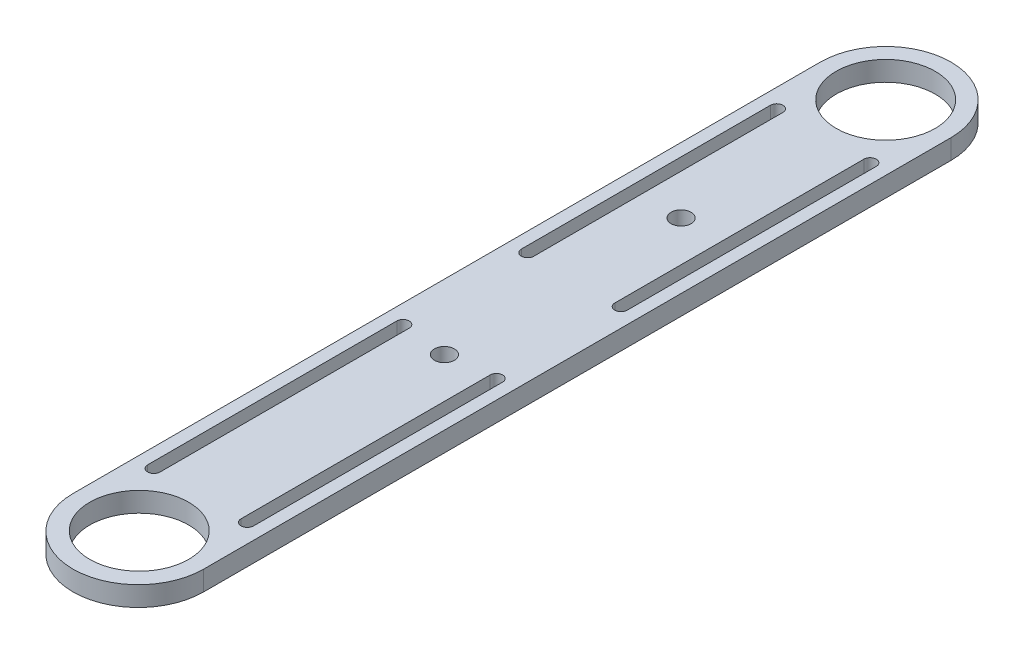
ISO-10303-21;
HEADER;
FILE_DESCRIPTION(('STEP AP214'),'2;1');
FILE_NAME('part.step','',(''),(''),'','','');
FILE_SCHEMA(('AUTOMOTIVE_DESIGN { 1 0 10303 214 1 1 1 1 }'));
ENDSEC;
DATA;
#1=APPLICATION_CONTEXT('core data for automotive mechanical design processes');
#2=APPLICATION_PROTOCOL_DEFINITION('international standard','automotive_design',2000,#1);
#3=PRODUCT_CONTEXT('',#1,'mechanical');
#4=PRODUCT('Part','Part','',(#3));
#5=PRODUCT_RELATED_PRODUCT_CATEGORY('part','',(#4));
#6=PRODUCT_DEFINITION_FORMATION('','',#4);
#7=PRODUCT_DEFINITION_CONTEXT('part definition',#1,'design');
#8=PRODUCT_DEFINITION('design','',#6,#7);
#9=PRODUCT_DEFINITION_SHAPE('','',#8);
#10=(LENGTH_UNIT() NAMED_UNIT(*) SI_UNIT(.MILLI.,.METRE.));
#11=(NAMED_UNIT(*) PLANE_ANGLE_UNIT() SI_UNIT($,.RADIAN.));
#12=(NAMED_UNIT(*) SI_UNIT($,.STERADIAN.) SOLID_ANGLE_UNIT());
#13=UNCERTAINTY_MEASURE_WITH_UNIT(LENGTH_MEASURE(1.E-05),#10,'distance_accuracy_value','');
#14=(GEOMETRIC_REPRESENTATION_CONTEXT(3) GLOBAL_UNCERTAINTY_ASSIGNED_CONTEXT((#13)) GLOBAL_UNIT_ASSIGNED_CONTEXT((#10,
#11,#12)) REPRESENTATION_CONTEXT('',''));
#15=CARTESIAN_POINT('',(0.,0.,0.));
#16=DIRECTION('',(0.,0.,1.));
#17=DIRECTION('',(1.,0.,0.));
#18=AXIS2_PLACEMENT_3D('',#15,#16,#17);
#19=CARTESIAN_POINT('',(0.,3.175,0.));
#20=DIRECTION('',(0.,-1.,0.));
#21=DIRECTION('',(0.,0.,-1.));
#22=AXIS2_PLACEMENT_3D('',#19,#20,#21);
#23=CYLINDRICAL_SURFACE('',#22,10.5);
#24=CARTESIAN_POINT('',(0.,0.,0.));
#25=DIRECTION('',(0.,1.,0.));
#26=DIRECTION('',(0.,0.,1.));
#27=AXIS2_PLACEMENT_3D('',#24,#25,#26);
#28=CIRCLE('',#27,10.5);
#29=CARTESIAN_POINT('',(10.5,0.,0.));
#30=VERTEX_POINT('',#29);
#31=CARTESIAN_POINT('',(-10.5,0.,0.));
#32=VERTEX_POINT('',#31);
#33=EDGE_CURVE('E275',#30,#32,#28,.T.);
#34=ORIENTED_EDGE('',*,*,#33,.T.);
#35=DIRECTION('',(0.,-1.,0.));
#36=VECTOR('',#35,1.);
#37=CARTESIAN_POINT('',(-10.5,3.175,0.));
#38=LINE('',#37,#36);
#39=CARTESIAN_POINT('',(-10.5,3.175,0.));
#40=VERTEX_POINT('',#39);
#41=EDGE_CURVE('E304',#40,#32,#38,.T.);
#42=ORIENTED_EDGE('',*,*,#41,.F.);
#43=CARTESIAN_POINT('',(0.,3.175,0.));
#44=DIRECTION('',(0.,1.,0.));
#45=DIRECTION('',(0.,0.,1.));
#46=AXIS2_PLACEMENT_3D('',#43,#44,#45);
#47=CIRCLE('',#46,10.5);
#48=CARTESIAN_POINT('',(10.5,3.175,0.));
#49=VERTEX_POINT('',#48);
#50=EDGE_CURVE('E278',#49,#40,#47,.T.);
#51=ORIENTED_EDGE('',*,*,#50,.F.);
#52=DIRECTION('',(0.,-1.,0.));
#53=VECTOR('',#52,1.);
#54=CARTESIAN_POINT('',(10.5,3.175,0.));
#55=LINE('',#54,#53);
#56=EDGE_CURVE('E288',#49,#30,#55,.T.);
#57=ORIENTED_EDGE('',*,*,#56,.T.);
#58=EDGE_LOOP('',(#34,#42,#51,#57));
#59=FACE_BOUND('',#58,.T.);
#60=ADVANCED_FACE('F33',(#59),#23,.T.);
#61=CARTESIAN_POINT('',(-10.5,3.175,0.));
#62=DIRECTION('',(1.,0.,0.));
#63=DIRECTION('',(0.,0.,-1.));
#64=AXIS2_PLACEMENT_3D('',#61,#62,#63);
#65=PLANE('',#64);
#66=DIRECTION('',(0.,0.,1.));
#67=VECTOR('',#66,1.);
#68=CARTESIAN_POINT('',(-10.5,0.,0.));
#69=LINE('',#68,#67);
#70=CARTESIAN_POINT('',(-10.5,0.,120.));
#71=VERTEX_POINT('',#70);
#72=EDGE_CURVE('E291',#32,#71,#69,.T.);
#73=ORIENTED_EDGE('',*,*,#72,.T.);
#74=DIRECTION('',(0.,-1.,0.));
#75=VECTOR('',#74,1.);
#76=CARTESIAN_POINT('',(-10.5,3.175,120.));
#77=LINE('',#76,#75);
#78=CARTESIAN_POINT('',(-10.5,3.175,120.));
#79=VERTEX_POINT('',#78);
#80=EDGE_CURVE('E301',#79,#71,#77,.T.);
#81=ORIENTED_EDGE('',*,*,#80,.F.);
#82=DIRECTION('',(0.,0.,1.));
#83=VECTOR('',#82,1.);
#84=CARTESIAN_POINT('',(-10.5,3.175,0.));
#85=LINE('',#84,#83);
#86=EDGE_CURVE('E281',#40,#79,#85,.T.);
#87=ORIENTED_EDGE('',*,*,#86,.F.);
#88=ORIENTED_EDGE('',*,*,#41,.T.);
#89=EDGE_LOOP('',(#73,#81,#87,#88));
#90=FACE_BOUND('',#89,.T.);
#91=ADVANCED_FACE('F410',(#90),#65,.F.);
#92=CARTESIAN_POINT('',(0.,3.175,120.));
#93=DIRECTION('',(0.,-1.,0.));
#94=DIRECTION('',(0.,0.,-1.));
#95=AXIS2_PLACEMENT_3D('',#92,#93,#94);
#96=CYLINDRICAL_SURFACE('',#95,10.5);
#97=CARTESIAN_POINT('',(0.,0.,120.));
#98=DIRECTION('',(0.,1.,0.));
#99=DIRECTION('',(0.,0.,1.));
#100=AXIS2_PLACEMENT_3D('',#97,#98,#99);
#101=CIRCLE('',#100,10.5);
#102=CARTESIAN_POINT('',(10.5,0.,120.));
#103=VERTEX_POINT('',#102);
#104=EDGE_CURVE('E293',#71,#103,#101,.T.);
#105=ORIENTED_EDGE('',*,*,#104,.T.);
#106=DIRECTION('',(0.,-1.,0.));
#107=VECTOR('',#106,1.);
#108=CARTESIAN_POINT('',(10.5,3.175,120.));
#109=LINE('',#108,#107);
#110=CARTESIAN_POINT('',(10.5,3.175,120.));
#111=VERTEX_POINT('',#110);
#112=EDGE_CURVE('E298',#111,#103,#109,.T.);
#113=ORIENTED_EDGE('',*,*,#112,.F.);
#114=CARTESIAN_POINT('',(0.,3.175,120.));
#115=DIRECTION('',(0.,1.,0.));
#116=DIRECTION('',(0.,0.,1.));
#117=AXIS2_PLACEMENT_3D('',#114,#115,#116);
#118=CIRCLE('',#117,10.5);
#119=EDGE_CURVE('E284',#79,#111,#118,.T.);
#120=ORIENTED_EDGE('',*,*,#119,.F.);
#121=ORIENTED_EDGE('',*,*,#80,.T.);
#122=EDGE_LOOP('',(#105,#113,#120,#121));
#123=FACE_BOUND('',#122,.T.);
#124=ADVANCED_FACE('F415',(#123),#96,.T.);
#125=CARTESIAN_POINT('',(10.5,3.175,0.));
#126=DIRECTION('',(-1.,0.,0.));
#127=DIRECTION('',(0.,0.,1.));
#128=AXIS2_PLACEMENT_3D('',#125,#126,#127);
#129=PLANE('',#128);
#130=DIRECTION('',(0.,0.,-1.));
#131=VECTOR('',#130,1.);
#132=CARTESIAN_POINT('',(10.5,0.,0.));
#133=LINE('',#132,#131);
#134=EDGE_CURVE('E282',#103,#30,#133,.T.);
#135=ORIENTED_EDGE('',*,*,#134,.T.);
#136=ORIENTED_EDGE('',*,*,#56,.F.);
#137=DIRECTION('',(0.,0.,-1.));
#138=VECTOR('',#137,1.);
#139=CARTESIAN_POINT('',(10.5,3.175,0.));
#140=LINE('',#139,#138);
#141=EDGE_CURVE('E286',#111,#49,#140,.T.);
#142=ORIENTED_EDGE('',*,*,#141,.F.);
#143=ORIENTED_EDGE('',*,*,#112,.T.);
#144=EDGE_LOOP('',(#135,#136,#142,#143));
#145=FACE_BOUND('',#144,.T.);
#146=ADVANCED_FACE('F379',(#145),#129,.F.);
#147=CARTESIAN_POINT('',(0.,3.175,0.));
#148=DIRECTION('',(0.,1.,0.));
#149=DIRECTION('',(0.,0.,1.));
#150=AXIS2_PLACEMENT_3D('',#147,#148,#149);
#151=PLANE('',#150);
#152=CARTESIAN_POINT('',(0.,3.175,32.8499999999999));
#153=DIRECTION('',(0.,1.,0.));
#154=DIRECTION('',(0.,0.,1.));
#155=AXIS2_PLACEMENT_3D('',#152,#153,#154);
#156=CIRCLE('',#155,1.6);
#157=CARTESIAN_POINT('',(0.,3.175,34.4499999999999));
#158=VERTEX_POINT('',#157);
#159=EDGE_CURVE('E349',#158,#158,#156,.T.);
#160=ORIENTED_EDGE('',*,*,#159,.F.);
#161=EDGE_LOOP('',(#160));
#162=FACE_BOUND('',#161,.T.);
#163=CARTESIAN_POINT('',(0.,3.175,70.8499999999999));
#164=DIRECTION('',(0.,1.,0.));
#165=DIRECTION('',(0.,0.,1.));
#166=AXIS2_PLACEMENT_3D('',#163,#164,#165);
#167=CIRCLE('',#166,1.60000000000001);
#168=CARTESIAN_POINT('',(0.,3.175,72.4499999999999));
#169=VERTEX_POINT('',#168);
#170=EDGE_CURVE('E355',#169,#169,#167,.T.);
#171=ORIENTED_EDGE('',*,*,#170,.F.);
#172=EDGE_LOOP('',(#171));
#173=FACE_BOUND('',#172,.T.);
#174=CARTESIAN_POINT('',(0.,3.175,0.));
#175=DIRECTION('',(0.,1.,0.));
#176=DIRECTION('',(0.,0.,1.));
#177=AXIS2_PLACEMENT_3D('',#174,#175,#176);
#178=CIRCLE('',#177,7.95);
#179=CARTESIAN_POINT('',(0.,3.175,7.94999999999997));
#180=VERTEX_POINT('',#179);
#181=EDGE_CURVE('E208',#180,#180,#178,.T.);
#182=ORIENTED_EDGE('',*,*,#181,.F.);
#183=EDGE_LOOP('',(#182));
#184=FACE_BOUND('',#183,.T.);
#185=CARTESIAN_POINT('',(-0.00322303505478905,3.175,119.850034656644));
#186=DIRECTION('',(0.,1.,0.));
#187=DIRECTION('',(0.,0.,1.));
#188=AXIS2_PLACEMENT_3D('',#185,#186,#187);
#189=CIRCLE('',#188,7.95);
#190=CARTESIAN_POINT('',(-0.00322303505478905,3.175,127.800034656644));
#191=VERTEX_POINT('',#190);
#192=EDGE_CURVE('E365',#191,#191,#189,.T.);
#193=ORIENTED_EDGE('',*,*,#192,.F.);
#194=EDGE_LOOP('',(#193));
#195=FACE_BOUND('',#194,.T.);
#196=CARTESIAN_POINT('',(-7.50000000000003,3.175,50.));
#197=DIRECTION('',(0.,-1.,0.));
#198=DIRECTION('',(0.,0.,-1.));
#199=AXIS2_PLACEMENT_3D('',#196,#197,#198);
#200=CIRCLE('',#199,0.999999999999999);
#201=CARTESIAN_POINT('',(-6.50000000000003,3.175,50.));
#202=VERTEX_POINT('',#201);
#203=CARTESIAN_POINT('',(-8.50000000000002,3.175,50.));
#204=VERTEX_POINT('',#203);
#205=EDGE_CURVE('E240',#202,#204,#200,.T.);
#206=ORIENTED_EDGE('',*,*,#205,.T.);
#207=DIRECTION('',(0.,0.,-1.));
#208=VECTOR('',#207,1.);
#209=CARTESIAN_POINT('',(-8.50000000000002,3.175,50.));
#210=LINE('',#209,#208);
#211=CARTESIAN_POINT('',(-8.50000000000002,3.175,10.));
#212=VERTEX_POINT('',#211);
#213=EDGE_CURVE('E243',#204,#212,#210,.T.);
#214=ORIENTED_EDGE('',*,*,#213,.T.);
#215=CARTESIAN_POINT('',(-7.50000000000003,3.175,10.));
#216=DIRECTION('',(0.,-1.,0.));
#217=DIRECTION('',(0.,0.,-1.));
#218=AXIS2_PLACEMENT_3D('',#215,#216,#217);
#219=CIRCLE('',#218,0.999999999999999);
#220=CARTESIAN_POINT('',(-6.50000000000003,3.175,10.));
#221=VERTEX_POINT('',#220);
#222=EDGE_CURVE('E51',#212,#221,#219,.T.);
#223=ORIENTED_EDGE('',*,*,#222,.T.);
#224=DIRECTION('',(0.,0.,1.));
#225=VECTOR('',#224,1.);
#226=CARTESIAN_POINT('',(-6.50000000000003,3.175,10.));
#227=LINE('',#226,#225);
#228=EDGE_CURVE('E247',#221,#202,#227,.T.);
#229=ORIENTED_EDGE('',*,*,#228,.T.);
#230=EDGE_LOOP('',(#206,#214,#223,#229));
#231=FACE_BOUND('',#230,.T.);
#232=CARTESIAN_POINT('',(7.49999999999997,3.175,10.));
#233=DIRECTION('',(0.,-1.,0.));
#234=DIRECTION('',(0.,0.,-1.));
#235=AXIS2_PLACEMENT_3D('',#232,#233,#234);
#236=CIRCLE('',#235,0.999999999999997);
#237=CARTESIAN_POINT('',(6.49999999999997,3.175,10.));
#238=VERTEX_POINT('',#237);
#239=CARTESIAN_POINT('',(8.49999999999997,3.175,10.));
#240=VERTEX_POINT('',#239);
#241=EDGE_CURVE('E220',#238,#240,#236,.T.);
#242=ORIENTED_EDGE('',*,*,#241,.T.);
#243=DIRECTION('',(0.,0.,1.));
#244=VECTOR('',#243,1.);
#245=CARTESIAN_POINT('',(8.49999999999997,3.175,10.));
#246=LINE('',#245,#244);
#247=CARTESIAN_POINT('',(8.49999999999997,3.175,50.));
#248=VERTEX_POINT('',#247);
#249=EDGE_CURVE('E223',#240,#248,#246,.T.);
#250=ORIENTED_EDGE('',*,*,#249,.T.);
#251=CARTESIAN_POINT('',(7.49999999999997,3.175,50.));
#252=DIRECTION('',(0.,-1.,0.));
#253=DIRECTION('',(0.,0.,-1.));
#254=AXIS2_PLACEMENT_3D('',#251,#252,#253);
#255=CIRCLE('',#254,0.999999999999999);
#256=CARTESIAN_POINT('',(6.49999999999997,3.175,50.));
#257=VERTEX_POINT('',#256);
#258=EDGE_CURVE('E227',#248,#257,#255,.T.);
#259=ORIENTED_EDGE('',*,*,#258,.T.);
#260=DIRECTION('',(0.,0.,-1.));
#261=VECTOR('',#260,1.);
#262=CARTESIAN_POINT('',(6.49999999999997,3.175,50.));
#263=LINE('',#262,#261);
#264=EDGE_CURVE('E230',#257,#238,#263,.T.);
#265=ORIENTED_EDGE('',*,*,#264,.T.);
#266=EDGE_LOOP('',(#242,#250,#259,#265));
#267=FACE_BOUND('',#266,.T.);
#268=CARTESIAN_POINT('',(7.49999999999984,3.175,110.));
#269=DIRECTION('',(0.,-1.,0.));
#270=DIRECTION('',(0.,0.,-1.));
#271=AXIS2_PLACEMENT_3D('',#268,#269,#270);
#272=CIRCLE('',#271,0.999999999999999);
#273=CARTESIAN_POINT('',(8.49999999999997,3.175,110.));
#274=VERTEX_POINT('',#273);
#275=CARTESIAN_POINT('',(6.49999999999997,3.175,110.));
#276=VERTEX_POINT('',#275);
#277=EDGE_CURVE('E181',#274,#276,#272,.T.);
#278=ORIENTED_EDGE('',*,*,#277,.T.);
#279=DIRECTION('',(0.,0.,-1.));
#280=VECTOR('',#279,1.);
#281=CARTESIAN_POINT('',(6.49999999999997,3.175,110.));
#282=LINE('',#281,#280);
#283=CARTESIAN_POINT('',(6.49999999999994,3.175,70.));
#284=VERTEX_POINT('',#283);
#285=EDGE_CURVE('E192',#276,#284,#282,.T.);
#286=ORIENTED_EDGE('',*,*,#285,.T.);
#287=CARTESIAN_POINT('',(7.49999999999994,3.175,70.0000000000001));
#288=DIRECTION('',(0.,-1.,0.));
#289=DIRECTION('',(0.,0.,-1.));
#290=AXIS2_PLACEMENT_3D('',#287,#288,#289);
#291=CIRCLE('',#290,1.00000000000001);
#292=CARTESIAN_POINT('',(8.49999999999997,3.175,70.));
#293=VERTEX_POINT('',#292);
#294=EDGE_CURVE('E197',#284,#293,#291,.T.);
#295=ORIENTED_EDGE('',*,*,#294,.T.);
#296=DIRECTION('',(0.,0.,1.));
#297=VECTOR('',#296,1.);
#298=CARTESIAN_POINT('',(8.49999999999997,3.175,70.));
#299=LINE('',#298,#297);
#300=EDGE_CURVE('E188',#293,#274,#299,.T.);
#301=ORIENTED_EDGE('',*,*,#300,.T.);
#302=EDGE_LOOP('',(#278,#286,#295,#301));
#303=FACE_BOUND('',#302,.T.);
#304=CARTESIAN_POINT('',(-7.50000000000005,3.175,70.));
#305=DIRECTION('',(0.,-1.,0.));
#306=DIRECTION('',(0.,0.,-1.));
#307=AXIS2_PLACEMENT_3D('',#304,#305,#306);
#308=CIRCLE('',#307,0.999999999999999);
#309=CARTESIAN_POINT('',(-8.50000000000002,3.175,70.));
#310=VERTEX_POINT('',#309);
#311=CARTESIAN_POINT('',(-6.50000000000003,3.175,70.));
#312=VERTEX_POINT('',#311);
#313=EDGE_CURVE('E217',#310,#312,#308,.T.);
#314=ORIENTED_EDGE('',*,*,#313,.T.);
#315=DIRECTION('',(0.,0.,1.));
#316=VECTOR('',#315,1.);
#317=CARTESIAN_POINT('',(-6.50000000000003,3.175,70.));
#318=LINE('',#317,#316);
#319=CARTESIAN_POINT('',(-6.50000000000003,3.175,110.));
#320=VERTEX_POINT('',#319);
#321=EDGE_CURVE('E260',#312,#320,#318,.T.);
#322=ORIENTED_EDGE('',*,*,#321,.T.);
#323=CARTESIAN_POINT('',(-7.50000000000016,3.175,110.));
#324=DIRECTION('',(0.,-1.,0.));
#325=DIRECTION('',(0.,0.,-1.));
#326=AXIS2_PLACEMENT_3D('',#323,#324,#325);
#327=CIRCLE('',#326,1.00000000000007);
#328=CARTESIAN_POINT('',(-8.50000000000016,3.175,110.));
#329=VERTEX_POINT('',#328);
#330=EDGE_CURVE('E115',#320,#329,#327,.T.);
#331=ORIENTED_EDGE('',*,*,#330,.T.);
#332=DIRECTION('',(0.,0.,-1.));
#333=VECTOR('',#332,1.);
#334=CARTESIAN_POINT('',(-8.50000000000016,3.175,110.));
#335=LINE('',#334,#333);
#336=EDGE_CURVE('E264',#329,#310,#335,.T.);
#337=ORIENTED_EDGE('',*,*,#336,.T.);
#338=EDGE_LOOP('',(#314,#322,#331,#337));
#339=FACE_BOUND('',#338,.T.);
#340=ORIENTED_EDGE('',*,*,#50,.T.);
#341=ORIENTED_EDGE('',*,*,#86,.T.);
#342=ORIENTED_EDGE('',*,*,#119,.T.);
#343=ORIENTED_EDGE('',*,*,#141,.T.);
#344=EDGE_LOOP('',(#340,#341,#342,#343));
#345=FACE_BOUND('',#344,.T.);
#346=ADVANCED_FACE('F199',(#162,#173,#184,#195,#231,#267,#303,#339,#345),#151,.T.);
#347=CARTESIAN_POINT('',(0.,0.,0.));
#348=DIRECTION('',(0.,1.,0.));
#349=DIRECTION('',(0.,0.,1.));
#350=AXIS2_PLACEMENT_3D('',#347,#348,#349);
#351=PLANE('',#350);
#352=CARTESIAN_POINT('',(0.,0.,32.8499999999999));
#353=DIRECTION('',(0.,1.,0.));
#354=DIRECTION('',(0.,0.,1.));
#355=AXIS2_PLACEMENT_3D('',#352,#353,#354);
#356=CIRCLE('',#355,1.6);
#357=CARTESIAN_POINT('',(0.,0.,34.4499999999999));
#358=VERTEX_POINT('',#357);
#359=EDGE_CURVE('E36',#358,#358,#356,.T.);
#360=ORIENTED_EDGE('',*,*,#359,.T.);
#361=EDGE_LOOP('',(#360));
#362=FACE_BOUND('',#361,.T.);
#363=CARTESIAN_POINT('',(0.,0.,70.8499999999999));
#364=DIRECTION('',(0.,1.,0.));
#365=DIRECTION('',(0.,0.,1.));
#366=AXIS2_PLACEMENT_3D('',#363,#364,#365);
#367=CIRCLE('',#366,1.60000000000001);
#368=CARTESIAN_POINT('',(0.,0.,72.4499999999999));
#369=VERTEX_POINT('',#368);
#370=EDGE_CURVE('E347',#369,#369,#367,.T.);
#371=ORIENTED_EDGE('',*,*,#370,.T.);
#372=EDGE_LOOP('',(#371));
#373=FACE_BOUND('',#372,.T.);
#374=CARTESIAN_POINT('',(0.,0.,0.));
#375=DIRECTION('',(0.,1.,0.));
#376=DIRECTION('',(0.,0.,1.));
#377=AXIS2_PLACEMENT_3D('',#374,#375,#376);
#378=CIRCLE('',#377,7.95);
#379=CARTESIAN_POINT('',(0.,0.,7.94999999999997));
#380=VERTEX_POINT('',#379);
#381=EDGE_CURVE('E362',#380,#380,#378,.T.);
#382=ORIENTED_EDGE('',*,*,#381,.T.);
#383=EDGE_LOOP('',(#382));
#384=FACE_BOUND('',#383,.T.);
#385=CARTESIAN_POINT('',(-0.00322303505478905,0.,119.850034656644));
#386=DIRECTION('',(0.,1.,0.));
#387=DIRECTION('',(0.,0.,1.));
#388=AXIS2_PLACEMENT_3D('',#385,#386,#387);
#389=CIRCLE('',#388,7.95);
#390=CARTESIAN_POINT('',(-0.00322303505478905,0.,127.800034656644));
#391=VERTEX_POINT('',#390);
#392=EDGE_CURVE('E353',#391,#391,#389,.T.);
#393=ORIENTED_EDGE('',*,*,#392,.T.);
#394=EDGE_LOOP('',(#393));
#395=FACE_BOUND('',#394,.T.);
#396=DIRECTION('',(0.,0.,1.));
#397=VECTOR('',#396,1.);
#398=CARTESIAN_POINT('',(-8.50000000000002,0.,0.));
#399=LINE('',#398,#397);
#400=CARTESIAN_POINT('',(-8.50000000000002,0.,10.));
#401=VERTEX_POINT('',#400);
#402=CARTESIAN_POINT('',(-8.50000000000002,0.,50.));
#403=VERTEX_POINT('',#402);
#404=EDGE_CURVE('E340',#401,#403,#399,.T.);
#405=ORIENTED_EDGE('',*,*,#404,.T.);
#406=CARTESIAN_POINT('',(-7.50000000000003,0.,50.));
#407=DIRECTION('',(0.,-1.,0.));
#408=DIRECTION('',(0.,0.,-1.));
#409=AXIS2_PLACEMENT_3D('',#406,#407,#408);
#410=CIRCLE('',#409,0.999999999999999);
#411=CARTESIAN_POINT('',(-6.50000000000003,0.,50.));
#412=VERTEX_POINT('',#411);
#413=EDGE_CURVE('E11',#403,#412,#410,.F.);
#414=ORIENTED_EDGE('',*,*,#413,.T.);
#415=DIRECTION('',(0.,0.,1.));
#416=VECTOR('',#415,1.);
#417=CARTESIAN_POINT('',(-6.50000000000003,0.,0.));
#418=LINE('',#417,#416);
#419=CARTESIAN_POINT('',(-6.50000000000003,0.,10.));
#420=VERTEX_POINT('',#419);
#421=EDGE_CURVE('E42',#412,#420,#418,.F.);
#422=ORIENTED_EDGE('',*,*,#421,.T.);
#423=CARTESIAN_POINT('',(-7.50000000000003,0.,10.));
#424=DIRECTION('',(0.,-1.,0.));
#425=DIRECTION('',(0.,0.,-1.));
#426=AXIS2_PLACEMENT_3D('',#423,#424,#425);
#427=CIRCLE('',#426,0.999999999999999);
#428=EDGE_CURVE('E343',#420,#401,#427,.F.);
#429=ORIENTED_EDGE('',*,*,#428,.T.);
#430=EDGE_LOOP('',(#405,#414,#422,#429));
#431=FACE_BOUND('',#430,.T.);
#432=DIRECTION('',(0.,0.,1.));
#433=VECTOR('',#432,1.);
#434=CARTESIAN_POINT('',(8.49999999999997,0.,0.));
#435=LINE('',#434,#433);
#436=CARTESIAN_POINT('',(8.49999999999997,0.,50.));
#437=VERTEX_POINT('',#436);
#438=CARTESIAN_POINT('',(8.49999999999997,0.,10.));
#439=VERTEX_POINT('',#438);
#440=EDGE_CURVE('E328',#437,#439,#435,.F.);
#441=ORIENTED_EDGE('',*,*,#440,.T.);
#442=CARTESIAN_POINT('',(7.49999999999997,0.,10.));
#443=DIRECTION('',(0.,-1.,0.));
#444=DIRECTION('',(0.,0.,-1.));
#445=AXIS2_PLACEMENT_3D('',#442,#443,#444);
#446=CIRCLE('',#445,0.999999999999997);
#447=CARTESIAN_POINT('',(6.49999999999997,0.,10.));
#448=VERTEX_POINT('',#447);
#449=EDGE_CURVE('E337',#439,#448,#446,.F.);
#450=ORIENTED_EDGE('',*,*,#449,.T.);
#451=DIRECTION('',(0.,0.,1.));
#452=VECTOR('',#451,1.);
#453=CARTESIAN_POINT('',(6.49999999999997,0.,0.));
#454=LINE('',#453,#452);
#455=CARTESIAN_POINT('',(6.49999999999997,0.,50.));
#456=VERTEX_POINT('',#455);
#457=EDGE_CURVE('E334',#448,#456,#454,.T.);
#458=ORIENTED_EDGE('',*,*,#457,.T.);
#459=CARTESIAN_POINT('',(7.49999999999997,0.,50.));
#460=DIRECTION('',(0.,-1.,0.));
#461=DIRECTION('',(0.,0.,-1.));
#462=AXIS2_PLACEMENT_3D('',#459,#460,#461);
#463=CIRCLE('',#462,0.999999999999999);
#464=EDGE_CURVE('E331',#456,#437,#463,.F.);
#465=ORIENTED_EDGE('',*,*,#464,.T.);
#466=EDGE_LOOP('',(#441,#450,#458,#465));
#467=FACE_BOUND('',#466,.T.);
#468=DIRECTION('',(0.,0.,1.));
#469=VECTOR('',#468,1.);
#470=CARTESIAN_POINT('',(6.49999999999994,0.,0.));
#471=LINE('',#470,#469);
#472=CARTESIAN_POINT('',(6.49999999999993,0.,70.));
#473=VERTEX_POINT('',#472);
#474=CARTESIAN_POINT('',(6.49999999999996,0.,110.));
#475=VERTEX_POINT('',#474);
#476=EDGE_CURVE('E319',#473,#475,#471,.T.);
#477=ORIENTED_EDGE('',*,*,#476,.T.);
#478=CARTESIAN_POINT('',(7.49999999999984,0.,110.));
#479=DIRECTION('',(0.,-1.,0.));
#480=DIRECTION('',(0.,0.,-1.));
#481=AXIS2_PLACEMENT_3D('',#478,#479,#480);
#482=CIRCLE('',#481,0.999999999999999);
#483=CARTESIAN_POINT('',(8.49999999999997,0.,110.));
#484=VERTEX_POINT('',#483);
#485=EDGE_CURVE('E184',#475,#484,#482,.F.);
#486=ORIENTED_EDGE('',*,*,#485,.T.);
#487=DIRECTION('',(0.,0.,1.));
#488=VECTOR('',#487,1.);
#489=CARTESIAN_POINT('',(8.49999999999997,0.,0.));
#490=LINE('',#489,#488);
#491=CARTESIAN_POINT('',(8.49999999999997,0.,70.));
#492=VERTEX_POINT('',#491);
#493=EDGE_CURVE('E324',#484,#492,#490,.F.);
#494=ORIENTED_EDGE('',*,*,#493,.T.);
#495=CARTESIAN_POINT('',(7.49999999999994,0.,70.0000000000001));
#496=DIRECTION('',(0.,-1.,0.));
#497=DIRECTION('',(0.,0.,-1.));
#498=AXIS2_PLACEMENT_3D('',#495,#496,#497);
#499=CIRCLE('',#498,1.00000000000001);
#500=EDGE_CURVE('E321',#492,#473,#499,.F.);
#501=ORIENTED_EDGE('',*,*,#500,.T.);
#502=EDGE_LOOP('',(#477,#486,#494,#501));
#503=FACE_BOUND('',#502,.T.);
#504=DIRECTION('',(0.,0.,1.));
#505=VECTOR('',#504,1.);
#506=CARTESIAN_POINT('',(-6.50000000000003,0.,0.));
#507=LINE('',#506,#505);
#508=CARTESIAN_POINT('',(-6.50000000000006,0.,110.));
#509=VERTEX_POINT('',#508);
#510=CARTESIAN_POINT('',(-6.50000000000003,0.,70.));
#511=VERTEX_POINT('',#510);
#512=EDGE_CURVE('E307',#509,#511,#507,.F.);
#513=ORIENTED_EDGE('',*,*,#512,.T.);
#514=CARTESIAN_POINT('',(-7.50000000000005,0.,70.));
#515=DIRECTION('',(0.,-1.,0.));
#516=DIRECTION('',(0.,0.,-1.));
#517=AXIS2_PLACEMENT_3D('',#514,#515,#516);
#518=CIRCLE('',#517,0.999999999999999);
#519=CARTESIAN_POINT('',(-8.50000000000002,0.,70.));
#520=VERTEX_POINT('',#519);
#521=EDGE_CURVE('E316',#511,#520,#518,.F.);
#522=ORIENTED_EDGE('',*,*,#521,.T.);
#523=DIRECTION('',(0.,0.,1.));
#524=VECTOR('',#523,1.);
#525=CARTESIAN_POINT('',(-8.50000000000002,0.,0.));
#526=LINE('',#525,#524);
#527=CARTESIAN_POINT('',(-8.50000000000009,0.,110.));
#528=VERTEX_POINT('',#527);
#529=EDGE_CURVE('E313',#520,#528,#526,.T.);
#530=ORIENTED_EDGE('',*,*,#529,.T.);
#531=CARTESIAN_POINT('',(-7.50000000000016,0.,110.));
#532=DIRECTION('',(0.,-1.,0.));
#533=DIRECTION('',(0.,0.,-1.));
#534=AXIS2_PLACEMENT_3D('',#531,#532,#533);
#535=CIRCLE('',#534,1.00000000000007);
#536=EDGE_CURVE('E310',#528,#509,#535,.F.);
#537=ORIENTED_EDGE('',*,*,#536,.T.);
#538=EDGE_LOOP('',(#513,#522,#530,#537));
#539=FACE_BOUND('',#538,.T.);
#540=ORIENTED_EDGE('',*,*,#33,.F.);
#541=ORIENTED_EDGE('',*,*,#134,.F.);
#542=ORIENTED_EDGE('',*,*,#104,.F.);
#543=ORIENTED_EDGE('',*,*,#72,.F.);
#544=EDGE_LOOP('',(#540,#541,#542,#543));
#545=FACE_BOUND('',#544,.T.);
#546=ADVANCED_FACE('F378',(#362,#373,#384,#395,#431,#467,#503,#539,#545),#351,.F.);
#547=CARTESIAN_POINT('',(-7.50000000000005,3.175,70.));
#548=DIRECTION('',(0.,-1.,0.));
#549=DIRECTION('',(0.,0.,-1.));
#550=AXIS2_PLACEMENT_3D('',#547,#548,#549);
#551=CYLINDRICAL_SURFACE('',#550,0.999999999999999);
#552=DIRECTION('',(0.,-1.,0.));
#553=VECTOR('',#552,1.);
#554=CARTESIAN_POINT('',(-6.50000000000003,3.175,70.));
#555=LINE('',#554,#553);
#556=EDGE_CURVE('E267',#312,#511,#555,.T.);
#557=ORIENTED_EDGE('',*,*,#556,.F.);
#558=ORIENTED_EDGE('',*,*,#313,.F.);
#559=DIRECTION('',(0.,-1.,0.));
#560=VECTOR('',#559,1.);
#561=CARTESIAN_POINT('',(-8.50000000000002,3.175,70.));
#562=LINE('',#561,#560);
#563=EDGE_CURVE('E271',#310,#520,#562,.T.);
#564=ORIENTED_EDGE('',*,*,#563,.T.);
#565=ORIENTED_EDGE('',*,*,#521,.F.);
#566=EDGE_LOOP('',(#557,#558,#564,#565));
#567=FACE_BOUND('',#566,.T.);
#568=ADVANCED_FACE('F439',(#567),#551,.F.);
#569=CARTESIAN_POINT('',(-8.50000000000016,3.175,110.));
#570=DIRECTION('',(-1.,0.,0.));
#571=DIRECTION('',(0.,0.,1.));
#572=AXIS2_PLACEMENT_3D('',#569,#570,#571);
#573=PLANE('',#572);
#574=ORIENTED_EDGE('',*,*,#563,.F.);
#575=ORIENTED_EDGE('',*,*,#336,.F.);
#576=DIRECTION('',(0.,-1.,0.));
#577=VECTOR('',#576,1.);
#578=CARTESIAN_POINT('',(-8.50000000000016,3.175,110.));
#579=LINE('',#578,#577);
#580=EDGE_CURVE('E268',#329,#528,#579,.T.);
#581=ORIENTED_EDGE('',*,*,#580,.T.);
#582=ORIENTED_EDGE('',*,*,#529,.F.);
#583=EDGE_LOOP('',(#574,#575,#581,#582));
#584=FACE_BOUND('',#583,.T.);
#585=ADVANCED_FACE('F444',(#584),#573,.F.);
#586=CARTESIAN_POINT('',(-7.50000000000016,3.175,110.));
#587=DIRECTION('',(0.,-1.,0.));
#588=DIRECTION('',(0.,0.,-1.));
#589=AXIS2_PLACEMENT_3D('',#586,#587,#588);
#590=CYLINDRICAL_SURFACE('',#589,1.00000000000007);
#591=ORIENTED_EDGE('',*,*,#580,.F.);
#592=ORIENTED_EDGE('',*,*,#330,.F.);
#593=DIRECTION('',(0.,-1.,0.));
#594=VECTOR('',#593,1.);
#595=CARTESIAN_POINT('',(-6.50000000000009,3.175,110.));
#596=LINE('',#595,#594);
#597=EDGE_CURVE('E272',#320,#509,#596,.T.);
#598=ORIENTED_EDGE('',*,*,#597,.T.);
#599=ORIENTED_EDGE('',*,*,#536,.F.);
#600=EDGE_LOOP('',(#591,#592,#598,#599));
#601=FACE_BOUND('',#600,.T.);
#602=ADVANCED_FACE('F449',(#601),#590,.F.);
#603=CARTESIAN_POINT('',(-6.50000000000003,3.175,70.));
#604=DIRECTION('',(1.,0.,0.));
#605=DIRECTION('',(0.,0.,-1.));
#606=AXIS2_PLACEMENT_3D('',#603,#604,#605);
#607=PLANE('',#606);
#608=ORIENTED_EDGE('',*,*,#597,.F.);
#609=ORIENTED_EDGE('',*,*,#321,.F.);
#610=ORIENTED_EDGE('',*,*,#556,.T.);
#611=ORIENTED_EDGE('',*,*,#512,.F.);
#612=EDGE_LOOP('',(#608,#609,#610,#611));
#613=FACE_BOUND('',#612,.T.);
#614=ADVANCED_FACE('F446',(#613),#607,.F.);
#615=CARTESIAN_POINT('',(7.49999999999984,3.175,110.));
#616=DIRECTION('',(0.,-1.,0.));
#617=DIRECTION('',(0.,0.,-1.));
#618=AXIS2_PLACEMENT_3D('',#615,#616,#617);
#619=CYLINDRICAL_SURFACE('',#618,0.999999999999999);
#620=DIRECTION('',(0.,-1.,0.));
#621=VECTOR('',#620,1.);
#622=CARTESIAN_POINT('',(6.49999999999997,3.175,110.));
#623=LINE('',#622,#621);
#624=EDGE_CURVE('E176',#276,#475,#623,.T.);
#625=ORIENTED_EDGE('',*,*,#624,.F.);
#626=ORIENTED_EDGE('',*,*,#277,.F.);
#627=DIRECTION('',(0.,-1.,0.));
#628=VECTOR('',#627,1.);
#629=CARTESIAN_POINT('',(8.49999999999997,3.175,110.));
#630=LINE('',#629,#628);
#631=EDGE_CURVE('E216',#274,#484,#630,.T.);
#632=ORIENTED_EDGE('',*,*,#631,.T.);
#633=ORIENTED_EDGE('',*,*,#485,.F.);
#634=EDGE_LOOP('',(#625,#626,#632,#633));
#635=FACE_BOUND('',#634,.T.);
#636=ADVANCED_FACE('F178',(#635),#619,.F.);
#637=CARTESIAN_POINT('',(8.49999999999997,3.175,70.));
#638=DIRECTION('',(1.,0.,0.));
#639=DIRECTION('',(0.,0.,-1.));
#640=AXIS2_PLACEMENT_3D('',#637,#638,#639);
#641=PLANE('',#640);
#642=ORIENTED_EDGE('',*,*,#631,.F.);
#643=ORIENTED_EDGE('',*,*,#300,.F.);
#644=DIRECTION('',(0.,-1.,0.));
#645=VECTOR('',#644,1.);
#646=CARTESIAN_POINT('',(8.49999999999997,3.175,70.));
#647=LINE('',#646,#645);
#648=EDGE_CURVE('E213',#293,#492,#647,.T.);
#649=ORIENTED_EDGE('',*,*,#648,.T.);
#650=ORIENTED_EDGE('',*,*,#493,.F.);
#651=EDGE_LOOP('',(#642,#643,#649,#650));
#652=FACE_BOUND('',#651,.T.);
#653=ADVANCED_FACE('F568',(#652),#641,.F.);
#654=CARTESIAN_POINT('',(7.49999999999994,3.175,70.0000000000001));
#655=DIRECTION('',(0.,-1.,0.));
#656=DIRECTION('',(0.,0.,-1.));
#657=AXIS2_PLACEMENT_3D('',#654,#655,#656);
#658=CYLINDRICAL_SURFACE('',#657,1.00000000000001);
#659=ORIENTED_EDGE('',*,*,#648,.F.);
#660=ORIENTED_EDGE('',*,*,#294,.F.);
#661=DIRECTION('',(0.,-1.,0.));
#662=VECTOR('',#661,1.);
#663=CARTESIAN_POINT('',(6.49999999999993,3.175,70.));
#664=LINE('',#663,#662);
#665=EDGE_CURVE('E187',#284,#473,#664,.T.);
#666=ORIENTED_EDGE('',*,*,#665,.T.);
#667=ORIENTED_EDGE('',*,*,#500,.F.);
#668=EDGE_LOOP('',(#659,#660,#666,#667));
#669=FACE_BOUND('',#668,.T.);
#670=ADVANCED_FACE('F560',(#669),#658,.F.);
#671=CARTESIAN_POINT('',(6.49999999999997,3.175,110.));
#672=DIRECTION('',(-1.,0.,0.));
#673=DIRECTION('',(0.,0.,1.));
#674=AXIS2_PLACEMENT_3D('',#671,#672,#673);
#675=PLANE('',#674);
#676=ORIENTED_EDGE('',*,*,#665,.F.);
#677=ORIENTED_EDGE('',*,*,#285,.F.);
#678=ORIENTED_EDGE('',*,*,#624,.T.);
#679=ORIENTED_EDGE('',*,*,#476,.F.);
#680=EDGE_LOOP('',(#676,#677,#678,#679));
#681=FACE_BOUND('',#680,.T.);
#682=ADVANCED_FACE('F193',(#681),#675,.F.);
#683=CARTESIAN_POINT('',(7.49999999999997,3.175,10.));
#684=DIRECTION('',(0.,-1.,0.));
#685=DIRECTION('',(0.,0.,-1.));
#686=AXIS2_PLACEMENT_3D('',#683,#684,#685);
#687=CYLINDRICAL_SURFACE('',#686,0.999999999999997);
#688=DIRECTION('',(0.,-1.,0.));
#689=VECTOR('',#688,1.);
#690=CARTESIAN_POINT('',(8.49999999999997,3.175,10.));
#691=LINE('',#690,#689);
#692=EDGE_CURVE('E233',#240,#439,#691,.T.);
#693=ORIENTED_EDGE('',*,*,#692,.F.);
#694=ORIENTED_EDGE('',*,*,#241,.F.);
#695=DIRECTION('',(0.,-1.,0.));
#696=VECTOR('',#695,1.);
#697=CARTESIAN_POINT('',(6.49999999999997,3.175,10.));
#698=LINE('',#697,#696);
#699=EDGE_CURVE('E202',#238,#448,#698,.T.);
#700=ORIENTED_EDGE('',*,*,#699,.T.);
#701=ORIENTED_EDGE('',*,*,#449,.F.);
#702=EDGE_LOOP('',(#693,#694,#700,#701));
#703=FACE_BOUND('',#702,.T.);
#704=ADVANCED_FACE('F389',(#703),#687,.F.);
#705=CARTESIAN_POINT('',(6.49999999999997,3.175,50.));
#706=DIRECTION('',(-1.,0.,0.));
#707=DIRECTION('',(0.,0.,1.));
#708=AXIS2_PLACEMENT_3D('',#705,#706,#707);
#709=PLANE('',#708);
#710=ORIENTED_EDGE('',*,*,#699,.F.);
#711=ORIENTED_EDGE('',*,*,#264,.F.);
#712=DIRECTION('',(0.,-1.,0.));
#713=VECTOR('',#712,1.);
#714=CARTESIAN_POINT('',(6.49999999999997,3.175,50.));
#715=LINE('',#714,#713);
#716=EDGE_CURVE('E205',#257,#456,#715,.T.);
#717=ORIENTED_EDGE('',*,*,#716,.T.);
#718=ORIENTED_EDGE('',*,*,#457,.F.);
#719=EDGE_LOOP('',(#710,#711,#717,#718));
#720=FACE_BOUND('',#719,.T.);
#721=ADVANCED_FACE('F399',(#720),#709,.F.);
#722=CARTESIAN_POINT('',(7.49999999999997,3.175,50.));
#723=DIRECTION('',(0.,-1.,0.));
#724=DIRECTION('',(0.,0.,-1.));
#725=AXIS2_PLACEMENT_3D('',#722,#723,#724);
#726=CYLINDRICAL_SURFACE('',#725,0.999999999999999);
#727=ORIENTED_EDGE('',*,*,#716,.F.);
#728=ORIENTED_EDGE('',*,*,#258,.F.);
#729=DIRECTION('',(0.,-1.,0.));
#730=VECTOR('',#729,1.);
#731=CARTESIAN_POINT('',(8.49999999999997,3.175,50.));
#732=LINE('',#731,#730);
#733=EDGE_CURVE('E235',#248,#437,#732,.T.);
#734=ORIENTED_EDGE('',*,*,#733,.T.);
#735=ORIENTED_EDGE('',*,*,#464,.F.);
#736=EDGE_LOOP('',(#727,#728,#734,#735));
#737=FACE_BOUND('',#736,.T.);
#738=ADVANCED_FACE('F395',(#737),#726,.F.);
#739=CARTESIAN_POINT('',(8.49999999999997,3.175,10.));
#740=DIRECTION('',(1.,0.,0.));
#741=DIRECTION('',(0.,0.,-1.));
#742=AXIS2_PLACEMENT_3D('',#739,#740,#741);
#743=PLANE('',#742);
#744=ORIENTED_EDGE('',*,*,#733,.F.);
#745=ORIENTED_EDGE('',*,*,#249,.F.);
#746=ORIENTED_EDGE('',*,*,#692,.T.);
#747=ORIENTED_EDGE('',*,*,#440,.F.);
#748=EDGE_LOOP('',(#744,#745,#746,#747));
#749=FACE_BOUND('',#748,.T.);
#750=ADVANCED_FACE('F393',(#749),#743,.F.);
#751=CARTESIAN_POINT('',(-7.50000000000003,3.175,50.));
#752=DIRECTION('',(0.,-1.,0.));
#753=DIRECTION('',(0.,0.,-1.));
#754=AXIS2_PLACEMENT_3D('',#751,#752,#753);
#755=CYLINDRICAL_SURFACE('',#754,0.999999999999999);
#756=DIRECTION('',(0.,-1.,0.));
#757=VECTOR('',#756,1.);
#758=CARTESIAN_POINT('',(-8.50000000000002,3.175,50.));
#759=LINE('',#758,#757);
#760=EDGE_CURVE('E107',#204,#403,#759,.T.);
#761=ORIENTED_EDGE('',*,*,#760,.F.);
#762=ORIENTED_EDGE('',*,*,#205,.F.);
#763=DIRECTION('',(0.,-1.,0.));
#764=VECTOR('',#763,1.);
#765=CARTESIAN_POINT('',(-6.50000000000003,3.175,50.));
#766=LINE('',#765,#764);
#767=EDGE_CURVE('E224',#202,#412,#766,.T.);
#768=ORIENTED_EDGE('',*,*,#767,.T.);
#769=ORIENTED_EDGE('',*,*,#413,.F.);
#770=EDGE_LOOP('',(#761,#762,#768,#769));
#771=FACE_BOUND('',#770,.T.);
#772=ADVANCED_FACE('F456',(#771),#755,.F.);
#773=CARTESIAN_POINT('',(-6.50000000000003,3.175,10.));
#774=DIRECTION('',(1.,0.,0.));
#775=DIRECTION('',(0.,0.,-1.));
#776=AXIS2_PLACEMENT_3D('',#773,#774,#775);
#777=PLANE('',#776);
#778=ORIENTED_EDGE('',*,*,#767,.F.);
#779=ORIENTED_EDGE('',*,*,#228,.F.);
#780=DIRECTION('',(0.,-1.,0.));
#781=VECTOR('',#780,1.);
#782=CARTESIAN_POINT('',(-6.50000000000003,3.175,10.));
#783=LINE('',#782,#781);
#784=EDGE_CURVE('E250',#221,#420,#783,.T.);
#785=ORIENTED_EDGE('',*,*,#784,.T.);
#786=ORIENTED_EDGE('',*,*,#421,.F.);
#787=EDGE_LOOP('',(#778,#779,#785,#786));
#788=FACE_BOUND('',#787,.T.);
#789=ADVANCED_FACE('F459',(#788),#777,.F.);
#790=CARTESIAN_POINT('',(-7.50000000000003,3.175,10.));
#791=DIRECTION('',(0.,-1.,0.));
#792=DIRECTION('',(0.,0.,-1.));
#793=AXIS2_PLACEMENT_3D('',#790,#791,#792);
#794=CYLINDRICAL_SURFACE('',#793,0.999999999999999);
#795=ORIENTED_EDGE('',*,*,#784,.F.);
#796=ORIENTED_EDGE('',*,*,#222,.F.);
#797=DIRECTION('',(0.,-1.,0.));
#798=VECTOR('',#797,1.);
#799=CARTESIAN_POINT('',(-8.50000000000002,3.175,10.));
#800=LINE('',#799,#798);
#801=EDGE_CURVE('E253',#212,#401,#800,.T.);
#802=ORIENTED_EDGE('',*,*,#801,.T.);
#803=ORIENTED_EDGE('',*,*,#428,.F.);
#804=EDGE_LOOP('',(#795,#796,#802,#803));
#805=FACE_BOUND('',#804,.T.);
#806=ADVANCED_FACE('F465',(#805),#794,.F.);
#807=CARTESIAN_POINT('',(-8.50000000000002,3.175,50.));
#808=DIRECTION('',(-1.,0.,0.));
#809=DIRECTION('',(0.,0.,1.));
#810=AXIS2_PLACEMENT_3D('',#807,#808,#809);
#811=PLANE('',#810);
#812=ORIENTED_EDGE('',*,*,#801,.F.);
#813=ORIENTED_EDGE('',*,*,#213,.F.);
#814=ORIENTED_EDGE('',*,*,#760,.T.);
#815=ORIENTED_EDGE('',*,*,#404,.F.);
#816=EDGE_LOOP('',(#812,#813,#814,#815));
#817=FACE_BOUND('',#816,.T.);
#818=ADVANCED_FACE('F461',(#817),#811,.F.);
#819=CARTESIAN_POINT('',(-0.00322303505478905,0.,119.850034656644));
#820=DIRECTION('',(0.,1.,0.));
#821=DIRECTION('',(0.,0.,1.));
#822=AXIS2_PLACEMENT_3D('',#819,#820,#821);
#823=CYLINDRICAL_SURFACE('',#822,7.95);
#824=ORIENTED_EDGE('',*,*,#192,.T.);
#825=EDGE_LOOP('',(#824));
#826=FACE_BOUND('',#825,.T.);
#827=ORIENTED_EDGE('',*,*,#392,.F.);
#828=EDGE_LOOP('',(#827));
#829=FACE_BOUND('',#828,.T.);
#830=ADVANCED_FACE('F464',(#826,#829),#823,.F.);
#831=CARTESIAN_POINT('',(0.,0.,0.));
#832=DIRECTION('',(0.,1.,0.));
#833=DIRECTION('',(0.,0.,1.));
#834=AXIS2_PLACEMENT_3D('',#831,#832,#833);
#835=CYLINDRICAL_SURFACE('',#834,7.95);
#836=ORIENTED_EDGE('',*,*,#181,.T.);
#837=EDGE_LOOP('',(#836));
#838=FACE_BOUND('',#837,.T.);
#839=ORIENTED_EDGE('',*,*,#381,.F.);
#840=EDGE_LOOP('',(#839));
#841=FACE_BOUND('',#840,.T.);
#842=ADVANCED_FACE('F373',(#838,#841),#835,.F.);
#843=CARTESIAN_POINT('',(0.,-6.825,70.8499999999999));
#844=DIRECTION('',(0.,1.,0.));
#845=DIRECTION('',(0.,0.,1.));
#846=AXIS2_PLACEMENT_3D('',#843,#844,#845);
#847=CYLINDRICAL_SURFACE('',#846,1.60000000000001);
#848=ORIENTED_EDGE('',*,*,#170,.T.);
#849=EDGE_LOOP('',(#848));
#850=FACE_BOUND('',#849,.T.);
#851=ORIENTED_EDGE('',*,*,#370,.F.);
#852=EDGE_LOOP('',(#851));
#853=FACE_BOUND('',#852,.T.);
#854=ADVANCED_FACE('F504',(#850,#853),#847,.F.);
#855=CARTESIAN_POINT('',(0.,-6.825,32.8499999999999));
#856=DIRECTION('',(0.,1.,0.));
#857=DIRECTION('',(0.,0.,1.));
#858=AXIS2_PLACEMENT_3D('',#855,#856,#857);
#859=CYLINDRICAL_SURFACE('',#858,1.6);
#860=ORIENTED_EDGE('',*,*,#159,.T.);
#861=EDGE_LOOP('',(#860));
#862=FACE_BOUND('',#861,.T.);
#863=ORIENTED_EDGE('',*,*,#359,.F.);
#864=EDGE_LOOP('',(#863));
#865=FACE_BOUND('',#864,.T.);
#866=ADVANCED_FACE('F512',(#862,#865),#859,.F.);
#867=CLOSED_SHELL('',(#60,#91,#124,#146,#346,#546,#568,#585,#602,#614,#636,#653,#670,#682,#704,
#721,#738,#750,#772,#789,#806,#818,#830,#842,#854,#866));
#868=MANIFOLD_SOLID_BREP('B2',#867);
#869=ADVANCED_BREP_SHAPE_REPRESENTATION('',(#18,#868),#14);
#870=SHAPE_DEFINITION_REPRESENTATION(#9,#869);
ENDSEC;
END-ISO-10303-21;
